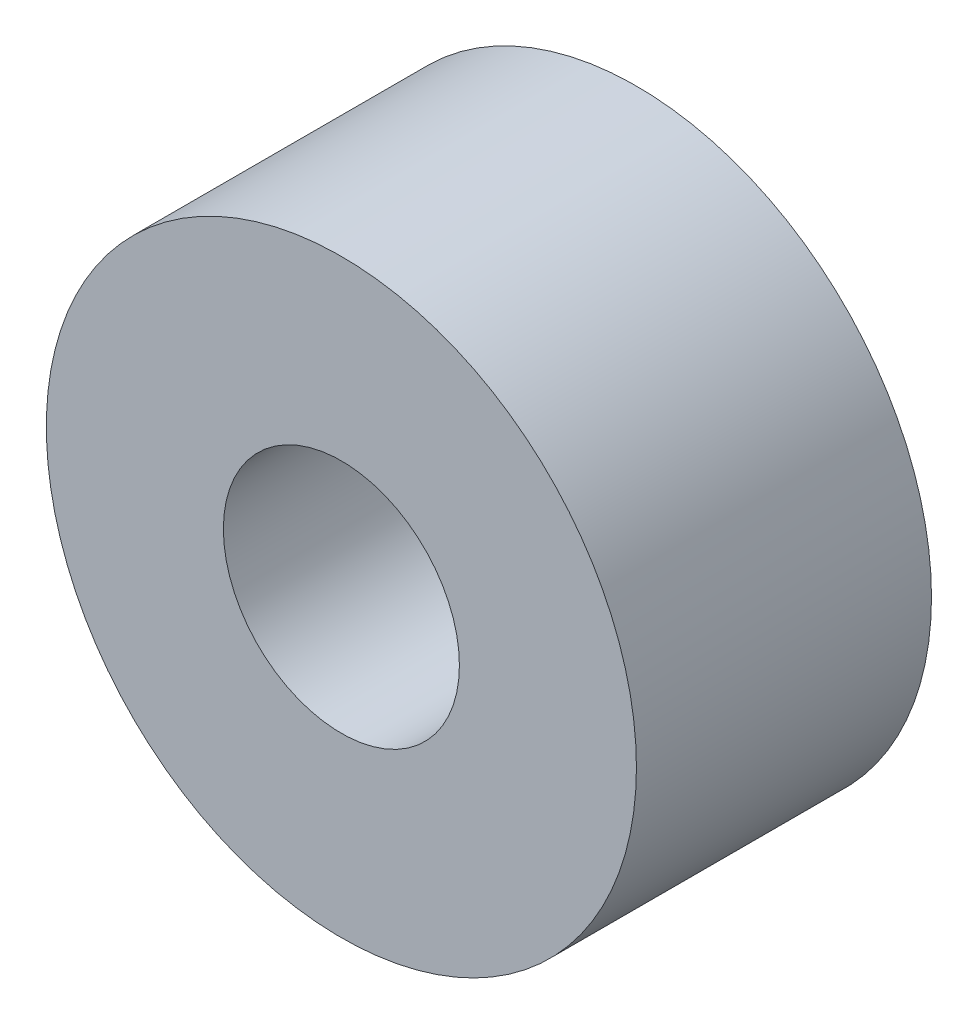
ISO-10303-21;
HEADER;
FILE_DESCRIPTION(('STEP AP214'),'2;1');
FILE_NAME('part.step','',(''),(''),'','','');
FILE_SCHEMA(('AUTOMOTIVE_DESIGN { 1 0 10303 214 1 1 1 1 }'));
ENDSEC;
DATA;
#1=APPLICATION_CONTEXT('core data for automotive mechanical design processes');
#2=APPLICATION_PROTOCOL_DEFINITION('international standard','automotive_design',2000,#1);
#3=PRODUCT_CONTEXT('',#1,'mechanical');
#4=PRODUCT('Part','Part','',(#3));
#5=PRODUCT_RELATED_PRODUCT_CATEGORY('part','',(#4));
#6=PRODUCT_DEFINITION_FORMATION('','',#4);
#7=PRODUCT_DEFINITION_CONTEXT('part definition',#1,'design');
#8=PRODUCT_DEFINITION('design','',#6,#7);
#9=PRODUCT_DEFINITION_SHAPE('','',#8);
#10=(LENGTH_UNIT() NAMED_UNIT(*) SI_UNIT(.MILLI.,.METRE.));
#11=(NAMED_UNIT(*) PLANE_ANGLE_UNIT() SI_UNIT($,.RADIAN.));
#12=(NAMED_UNIT(*) SI_UNIT($,.STERADIAN.) SOLID_ANGLE_UNIT());
#13=UNCERTAINTY_MEASURE_WITH_UNIT(LENGTH_MEASURE(1.E-05),#10,'distance_accuracy_value','');
#14=(GEOMETRIC_REPRESENTATION_CONTEXT(3) GLOBAL_UNCERTAINTY_ASSIGNED_CONTEXT((#13)) GLOBAL_UNIT_ASSIGNED_CONTEXT((#10,
#11,#12)) REPRESENTATION_CONTEXT('',''));
#15=CARTESIAN_POINT('',(0.,0.,0.));
#16=DIRECTION('',(0.,0.,1.));
#17=DIRECTION('',(1.,0.,0.));
#18=AXIS2_PLACEMENT_3D('',#15,#16,#17);
#19=CARTESIAN_POINT('',(0.,0.,4.));
#20=DIRECTION('',(0.,0.,1.));
#21=DIRECTION('',(1.,0.,0.));
#22=AXIS2_PLACEMENT_3D('',#19,#20,#21);
#23=PLANE('',#22);
#24=CARTESIAN_POINT('',(0.,0.,4.));
#25=DIRECTION('',(0.,0.,1.));
#26=DIRECTION('',(1.,0.,0.));
#27=AXIS2_PLACEMENT_3D('',#24,#25,#26);
#28=CIRCLE('',#27,4.);
#29=CARTESIAN_POINT('',(4.,0.,4.));
#30=VERTEX_POINT('',#29);
#31=EDGE_CURVE('E10',#30,#30,#28,.T.);
#32=ORIENTED_EDGE('',*,*,#31,.T.);
#33=EDGE_LOOP('',(#32));
#34=FACE_BOUND('',#33,.T.);
#35=CARTESIAN_POINT('',(0.,0.,4.));
#36=DIRECTION('',(0.,0.,1.));
#37=DIRECTION('',(1.,0.,0.));
#38=AXIS2_PLACEMENT_3D('',#35,#36,#37);
#39=CIRCLE('',#38,1.6);
#40=CARTESIAN_POINT('',(1.6,0.,4.));
#41=VERTEX_POINT('',#40);
#42=EDGE_CURVE('E42',#41,#41,#39,.T.);
#43=ORIENTED_EDGE('',*,*,#42,.F.);
#44=EDGE_LOOP('',(#43));
#45=FACE_BOUND('',#44,.T.);
#46=ADVANCED_FACE('F31',(#34,#45),#23,.T.);
#47=CARTESIAN_POINT('',(0.,0.,0.));
#48=DIRECTION('',(0.,0.,1.));
#49=DIRECTION('',(1.,0.,0.));
#50=AXIS2_PLACEMENT_3D('',#47,#48,#49);
#51=PLANE('',#50);
#52=CARTESIAN_POINT('',(0.,0.,0.));
#53=DIRECTION('',(0.,0.,1.));
#54=DIRECTION('',(1.,0.,0.));
#55=AXIS2_PLACEMENT_3D('',#52,#53,#54);
#56=CIRCLE('',#55,4.);
#57=CARTESIAN_POINT('',(4.,0.,0.));
#58=VERTEX_POINT('',#57);
#59=EDGE_CURVE('E35',#58,#58,#56,.T.);
#60=ORIENTED_EDGE('',*,*,#59,.F.);
#61=EDGE_LOOP('',(#60));
#62=FACE_BOUND('',#61,.T.);
#63=CARTESIAN_POINT('',(0.,0.,0.));
#64=DIRECTION('',(0.,0.,1.));
#65=DIRECTION('',(1.,0.,0.));
#66=AXIS2_PLACEMENT_3D('',#63,#64,#65);
#67=CIRCLE('',#66,1.6);
#68=CARTESIAN_POINT('',(1.6,0.,0.));
#69=VERTEX_POINT('',#68);
#70=EDGE_CURVE('E44',#69,#69,#67,.T.);
#71=ORIENTED_EDGE('',*,*,#70,.T.);
#72=EDGE_LOOP('',(#71));
#73=FACE_BOUND('',#72,.T.);
#74=ADVANCED_FACE('F54',(#62,#73),#51,.F.);
#75=CARTESIAN_POINT('',(0.,0.,4.));
#76=DIRECTION('',(0.,0.,-1.));
#77=DIRECTION('',(-1.,0.,0.));
#78=AXIS2_PLACEMENT_3D('',#75,#76,#77);
#79=CYLINDRICAL_SURFACE('',#78,4.);
#80=ORIENTED_EDGE('',*,*,#31,.F.);
#81=EDGE_LOOP('',(#80));
#82=FACE_BOUND('',#81,.T.);
#83=ORIENTED_EDGE('',*,*,#59,.T.);
#84=EDGE_LOOP('',(#83));
#85=FACE_BOUND('',#84,.T.);
#86=ADVANCED_FACE('F33',(#82,#85),#79,.T.);
#87=CARTESIAN_POINT('',(0.,0.,4.));
#88=DIRECTION('',(0.,0.,-1.));
#89=DIRECTION('',(-1.,0.,0.));
#90=AXIS2_PLACEMENT_3D('',#87,#88,#89);
#91=CYLINDRICAL_SURFACE('',#90,1.6);
#92=ORIENTED_EDGE('',*,*,#42,.T.);
#93=EDGE_LOOP('',(#92));
#94=FACE_BOUND('',#93,.T.);
#95=ORIENTED_EDGE('',*,*,#70,.F.);
#96=EDGE_LOOP('',(#95));
#97=FACE_BOUND('',#96,.T.);
#98=ADVANCED_FACE('F50',(#94,#97),#91,.F.);
#99=CLOSED_SHELL('',(#46,#74,#86,#98));
#100=MANIFOLD_SOLID_BREP('B2',#99);
#101=ADVANCED_BREP_SHAPE_REPRESENTATION('',(#18,#100),#14);
#102=SHAPE_DEFINITION_REPRESENTATION(#9,#101);
ENDSEC;
END-ISO-10303-21;
